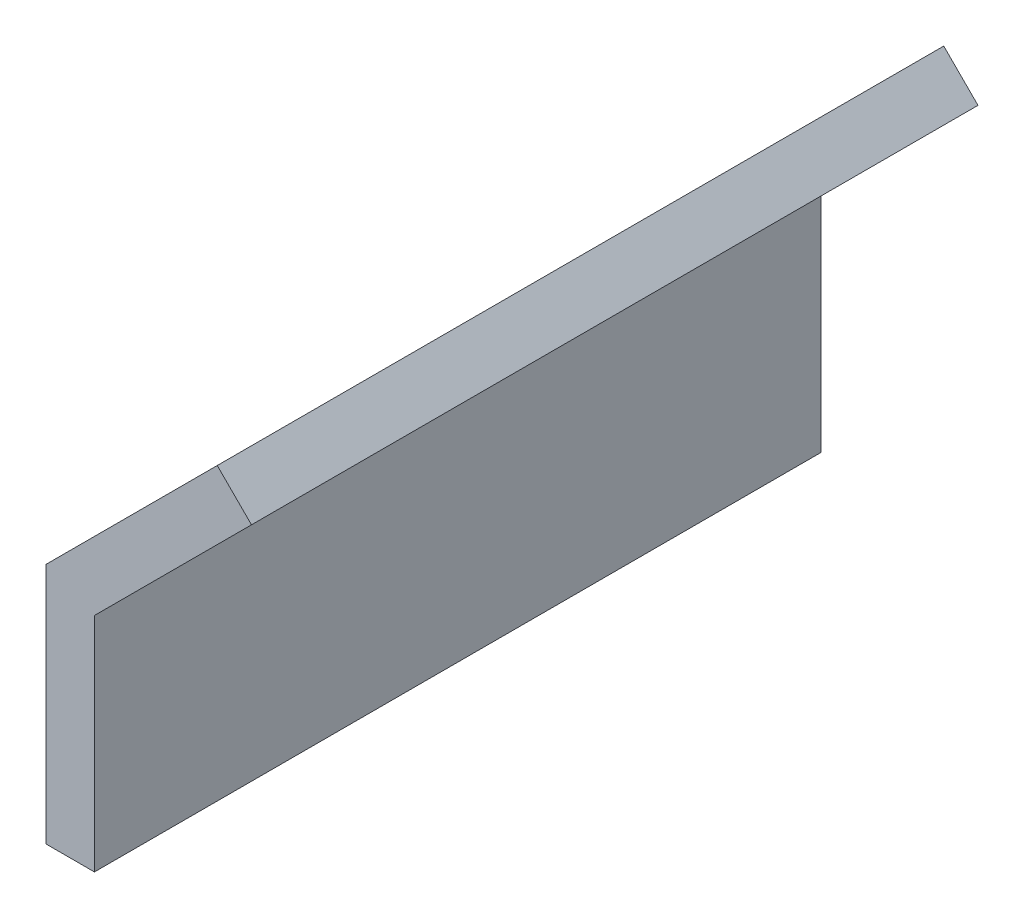
ISO-10303-21;
HEADER;
FILE_DESCRIPTION(('STEP AP214'),'2;1');
FILE_NAME('part.step','',(''),(''),'','','');
FILE_SCHEMA(('AUTOMOTIVE_DESIGN { 1 0 10303 214 1 1 1 1 }'));
ENDSEC;
DATA;
#1=APPLICATION_CONTEXT('core data for automotive mechanical design processes');
#2=APPLICATION_PROTOCOL_DEFINITION('international standard','automotive_design',2000,#1);
#3=PRODUCT_CONTEXT('',#1,'mechanical');
#4=PRODUCT('Part','Part','',(#3));
#5=PRODUCT_RELATED_PRODUCT_CATEGORY('part','',(#4));
#6=PRODUCT_DEFINITION_FORMATION('','',#4);
#7=PRODUCT_DEFINITION_CONTEXT('part definition',#1,'design');
#8=PRODUCT_DEFINITION('design','',#6,#7);
#9=PRODUCT_DEFINITION_SHAPE('','',#8);
#10=(LENGTH_UNIT() NAMED_UNIT(*) SI_UNIT(.MILLI.,.METRE.));
#11=(NAMED_UNIT(*) PLANE_ANGLE_UNIT() SI_UNIT($,.RADIAN.));
#12=(NAMED_UNIT(*) SI_UNIT($,.STERADIAN.) SOLID_ANGLE_UNIT());
#13=UNCERTAINTY_MEASURE_WITH_UNIT(LENGTH_MEASURE(1.E-05),#10,'distance_accuracy_value','');
#14=(GEOMETRIC_REPRESENTATION_CONTEXT(3) GLOBAL_UNCERTAINTY_ASSIGNED_CONTEXT((#13)) GLOBAL_UNIT_ASSIGNED_CONTEXT((#10,
#11,#12)) REPRESENTATION_CONTEXT('',''));
#15=CARTESIAN_POINT('',(0.,0.,0.));
#16=DIRECTION('',(0.,0.,1.));
#17=DIRECTION('',(1.,0.,0.));
#18=AXIS2_PLACEMENT_3D('',#15,#16,#17);
#19=CARTESIAN_POINT('',(0.,12.7,38.1));
#20=DIRECTION('',(1.,0.,0.));
#21=DIRECTION('',(0.,1.,0.));
#22=AXIS2_PLACEMENT_3D('',#19,#20,#21);
#23=PLANE('',#22);
#24=DIRECTION('',(0.,-1.,0.));
#25=VECTOR('',#24,1.);
#26=CARTESIAN_POINT('',(0.,12.7,0.));
#27=LINE('',#26,#25);
#28=CARTESIAN_POINT('',(0.,12.7,0.));
#29=VERTEX_POINT('',#28);
#30=CARTESIAN_POINT('',(0.,0.,0.));
#31=VERTEX_POINT('',#30);
#32=EDGE_CURVE('E132',#29,#31,#27,.T.);
#33=ORIENTED_EDGE('',*,*,#32,.T.);
#34=DIRECTION('',(0.,0.,-1.));
#35=VECTOR('',#34,1.);
#36=CARTESIAN_POINT('',(0.,0.,38.1));
#37=LINE('',#36,#35);
#38=CARTESIAN_POINT('',(0.,0.,38.1));
#39=VERTEX_POINT('',#38);
#40=EDGE_CURVE('E11',#39,#31,#37,.T.);
#41=ORIENTED_EDGE('',*,*,#40,.F.);
#42=DIRECTION('',(0.,-1.,0.));
#43=VECTOR('',#42,1.);
#44=CARTESIAN_POINT('',(0.,12.7,38.1));
#45=LINE('',#44,#43);
#46=CARTESIAN_POINT('',(0.,12.7,38.1));
#47=VERTEX_POINT('',#46);
#48=EDGE_CURVE('E148',#47,#39,#45,.T.);
#49=ORIENTED_EDGE('',*,*,#48,.F.);
#50=DIRECTION('',(0.,0.,-1.));
#51=VECTOR('',#50,1.);
#52=CARTESIAN_POINT('',(0.,12.7,38.1));
#53=LINE('',#52,#51);
#54=EDGE_CURVE('E128',#47,#29,#53,.T.);
#55=ORIENTED_EDGE('',*,*,#54,.T.);
#56=EDGE_LOOP('',(#33,#41,#49,#55));
#57=FACE_BOUND('',#56,.T.);
#58=ADVANCED_FACE('F43',(#57),#23,.F.);
#59=CARTESIAN_POINT('',(0.,0.,38.1));
#60=DIRECTION('',(0.,1.,0.));
#61=DIRECTION('',(0.,0.,1.));
#62=AXIS2_PLACEMENT_3D('',#59,#60,#61);
#63=PLANE('',#62);
#64=DIRECTION('',(1.,0.,0.));
#65=VECTOR('',#64,1.);
#66=CARTESIAN_POINT('',(0.,0.,0.));
#67=LINE('',#66,#65);
#68=CARTESIAN_POINT('',(2.54,0.,0.));
#69=VERTEX_POINT('',#68);
#70=EDGE_CURVE('E136',#31,#69,#67,.T.);
#71=ORIENTED_EDGE('',*,*,#70,.T.);
#72=DIRECTION('',(0.,0.,-1.));
#73=VECTOR('',#72,1.);
#74=CARTESIAN_POINT('',(2.54,0.,38.1));
#75=LINE('',#74,#73);
#76=CARTESIAN_POINT('',(2.54,0.,38.1));
#77=VERTEX_POINT('',#76);
#78=EDGE_CURVE('E52',#77,#69,#75,.T.);
#79=ORIENTED_EDGE('',*,*,#78,.F.);
#80=DIRECTION('',(1.,0.,0.));
#81=VECTOR('',#80,1.);
#82=CARTESIAN_POINT('',(0.,0.,38.1));
#83=LINE('',#82,#81);
#84=EDGE_CURVE('E97',#39,#77,#83,.T.);
#85=ORIENTED_EDGE('',*,*,#84,.F.);
#86=ORIENTED_EDGE('',*,*,#40,.T.);
#87=EDGE_LOOP('',(#71,#79,#85,#86));
#88=FACE_BOUND('',#87,.T.);
#89=ADVANCED_FACE('F176',(#88),#63,.F.);
#90=CARTESIAN_POINT('',(2.54,0.,38.1));
#91=DIRECTION('',(-1.,0.,0.));
#92=DIRECTION('',(0.,0.,1.));
#93=AXIS2_PLACEMENT_3D('',#90,#91,#92);
#94=PLANE('',#93);
#95=DIRECTION('',(0.,1.,0.));
#96=VECTOR('',#95,1.);
#97=CARTESIAN_POINT('',(2.54,0.,0.));
#98=LINE('',#97,#96);
#99=CARTESIAN_POINT('',(2.54,11.6478975515723,0.));
#100=VERTEX_POINT('',#99);
#101=EDGE_CURVE('E139',#69,#100,#98,.T.);
#102=ORIENTED_EDGE('',*,*,#101,.T.);
#103=DIRECTION('',(0.,0.,-1.));
#104=VECTOR('',#103,1.);
#105=CARTESIAN_POINT('',(2.54,11.6478975515723,38.1));
#106=LINE('',#105,#104);
#107=CARTESIAN_POINT('',(2.54,11.6478975515723,38.1));
#108=VERTEX_POINT('',#107);
#109=EDGE_CURVE('E121',#108,#100,#106,.T.);
#110=ORIENTED_EDGE('',*,*,#109,.F.);
#111=DIRECTION('',(0.,1.,0.));
#112=VECTOR('',#111,1.);
#113=CARTESIAN_POINT('',(2.54,0.,38.1));
#114=LINE('',#113,#112);
#115=EDGE_CURVE('E110',#77,#108,#114,.T.);
#116=ORIENTED_EDGE('',*,*,#115,.F.);
#117=ORIENTED_EDGE('',*,*,#78,.T.);
#118=EDGE_LOOP('',(#102,#110,#116,#117));
#119=FACE_BOUND('',#118,.T.);
#120=ADVANCED_FACE('F158',(#119),#94,.F.);
#121=CARTESIAN_POINT('',(2.54,11.6478975515723,38.1));
#122=DIRECTION('',(-0.707106781186546,0.707106781186549,0.));
#123=DIRECTION('',(-0.707106781186549,-0.707106781186546,0.));
#124=AXIS2_PLACEMENT_3D('',#121,#122,#123);
#125=PLANE('',#124);
#126=DIRECTION('',(0.707106781186549,0.707106781186546,0.));
#127=VECTOR('',#126,1.);
#128=CARTESIAN_POINT('',(2.54,11.6478975515723,0.));
#129=LINE('',#128,#127);
#130=CARTESIAN_POINT('',(10.776307345283,19.8842048968553,0.));
#131=VERTEX_POINT('',#130);
#132=EDGE_CURVE('E119',#100,#131,#129,.T.);
#133=ORIENTED_EDGE('',*,*,#132,.T.);
#134=DIRECTION('',(0.,0.,-1.));
#135=VECTOR('',#134,1.);
#136=CARTESIAN_POINT('',(10.776307345283,19.8842048968553,38.1));
#137=LINE('',#136,#135);
#138=CARTESIAN_POINT('',(10.776307345283,19.8842048968553,38.1));
#139=VERTEX_POINT('',#138);
#140=EDGE_CURVE('E116',#139,#131,#137,.T.);
#141=ORIENTED_EDGE('',*,*,#140,.F.);
#142=DIRECTION('',(0.707106781186549,0.707106781186546,0.));
#143=VECTOR('',#142,1.);
#144=CARTESIAN_POINT('',(2.54,11.6478975515723,38.1));
#145=LINE('',#144,#143);
#146=EDGE_CURVE('E104',#108,#139,#145,.T.);
#147=ORIENTED_EDGE('',*,*,#146,.F.);
#148=ORIENTED_EDGE('',*,*,#109,.T.);
#149=EDGE_LOOP('',(#133,#141,#147,#148));
#150=FACE_BOUND('',#149,.T.);
#151=ADVANCED_FACE('F117',(#150),#125,.F.);
#152=CARTESIAN_POINT('',(10.776307345283,19.8842048968553,38.1));
#153=DIRECTION('',(-0.707106781186549,-0.707106781186546,0.));
#154=DIRECTION('',(0.707106781186546,-0.707106781186549,0.));
#155=AXIS2_PLACEMENT_3D('',#152,#153,#154);
#156=PLANE('',#155);
#157=DIRECTION('',(-0.707106781186546,0.707106781186549,0.));
#158=VECTOR('',#157,1.);
#159=CARTESIAN_POINT('',(10.776307345283,19.8842048968553,0.));
#160=LINE('',#159,#158);
#161=CARTESIAN_POINT('',(8.98025612106917,21.6802561210691,0.));
#162=VERTEX_POINT('',#161);
#163=EDGE_CURVE('E83',#131,#162,#160,.T.);
#164=ORIENTED_EDGE('',*,*,#163,.T.);
#165=DIRECTION('',(0.,0.,-1.));
#166=VECTOR('',#165,1.);
#167=CARTESIAN_POINT('',(8.98025612106917,21.6802561210691,38.1));
#168=LINE('',#167,#166);
#169=CARTESIAN_POINT('',(8.98025612106917,21.6802561210691,38.1));
#170=VERTEX_POINT('',#169);
#171=EDGE_CURVE('E122',#170,#162,#168,.T.);
#172=ORIENTED_EDGE('',*,*,#171,.F.);
#173=DIRECTION('',(-0.707106781186546,0.707106781186549,0.));
#174=VECTOR('',#173,1.);
#175=CARTESIAN_POINT('',(10.776307345283,19.8842048968553,38.1));
#176=LINE('',#175,#174);
#177=EDGE_CURVE('E108',#139,#170,#176,.T.);
#178=ORIENTED_EDGE('',*,*,#177,.F.);
#179=ORIENTED_EDGE('',*,*,#140,.T.);
#180=EDGE_LOOP('',(#164,#172,#178,#179));
#181=FACE_BOUND('',#180,.T.);
#182=ADVANCED_FACE('F124',(#181),#156,.F.);
#183=CARTESIAN_POINT('',(8.98025612106917,21.6802561210691,38.1));
#184=DIRECTION('',(0.707106781186546,-0.707106781186548,0.));
#185=DIRECTION('',(0.707106781186549,0.707106781186547,0.));
#186=AXIS2_PLACEMENT_3D('',#183,#184,#185);
#187=PLANE('',#186);
#188=DIRECTION('',(-0.707106781186548,-0.707106781186546,0.));
#189=VECTOR('',#188,1.);
#190=CARTESIAN_POINT('',(8.98025612106917,21.6802561210691,0.));
#191=LINE('',#190,#189);
#192=EDGE_CURVE('E89',#162,#29,#191,.T.);
#193=ORIENTED_EDGE('',*,*,#192,.T.);
#194=ORIENTED_EDGE('',*,*,#54,.F.);
#195=DIRECTION('',(-0.707106781186548,-0.707106781186546,0.));
#196=VECTOR('',#195,1.);
#197=CARTESIAN_POINT('',(8.98025612106917,21.6802561210691,38.1));
#198=LINE('',#197,#196);
#199=EDGE_CURVE('E60',#170,#47,#198,.T.);
#200=ORIENTED_EDGE('',*,*,#199,.F.);
#201=ORIENTED_EDGE('',*,*,#171,.T.);
#202=EDGE_LOOP('',(#193,#194,#200,#201));
#203=FACE_BOUND('',#202,.T.);
#204=ADVANCED_FACE('F165',(#203),#187,.F.);
#205=CARTESIAN_POINT('',(0.,0.,38.1));
#206=DIRECTION('',(0.,0.,1.));
#207=DIRECTION('',(1.,0.,0.));
#208=AXIS2_PLACEMENT_3D('',#205,#206,#207);
#209=PLANE('',#208);
#210=ORIENTED_EDGE('',*,*,#48,.T.);
#211=ORIENTED_EDGE('',*,*,#84,.T.);
#212=ORIENTED_EDGE('',*,*,#115,.T.);
#213=ORIENTED_EDGE('',*,*,#146,.T.);
#214=ORIENTED_EDGE('',*,*,#177,.T.);
#215=ORIENTED_EDGE('',*,*,#199,.T.);
#216=EDGE_LOOP('',(#210,#211,#212,#213,#214,#215));
#217=FACE_BOUND('',#216,.T.);
#218=ADVANCED_FACE('F106',(#217),#209,.T.);
#219=CARTESIAN_POINT('',(0.,0.,0.));
#220=DIRECTION('',(0.,0.,1.));
#221=DIRECTION('',(1.,0.,0.));
#222=AXIS2_PLACEMENT_3D('',#219,#220,#221);
#223=PLANE('',#222);
#224=ORIENTED_EDGE('',*,*,#32,.F.);
#225=ORIENTED_EDGE('',*,*,#192,.F.);
#226=ORIENTED_EDGE('',*,*,#163,.F.);
#227=ORIENTED_EDGE('',*,*,#132,.F.);
#228=ORIENTED_EDGE('',*,*,#101,.F.);
#229=ORIENTED_EDGE('',*,*,#70,.F.);
#230=EDGE_LOOP('',(#224,#225,#226,#227,#228,#229));
#231=FACE_BOUND('',#230,.T.);
#232=ADVANCED_FACE('F161',(#231),#223,.F.);
#233=CLOSED_SHELL('',(#58,#89,#120,#151,#182,#204,#218,#232));
#234=MANIFOLD_SOLID_BREP('B2',#233);
#235=ADVANCED_BREP_SHAPE_REPRESENTATION('',(#18,#234),#14);
#236=SHAPE_DEFINITION_REPRESENTATION(#9,#235);
ENDSEC;
END-ISO-10303-21;
